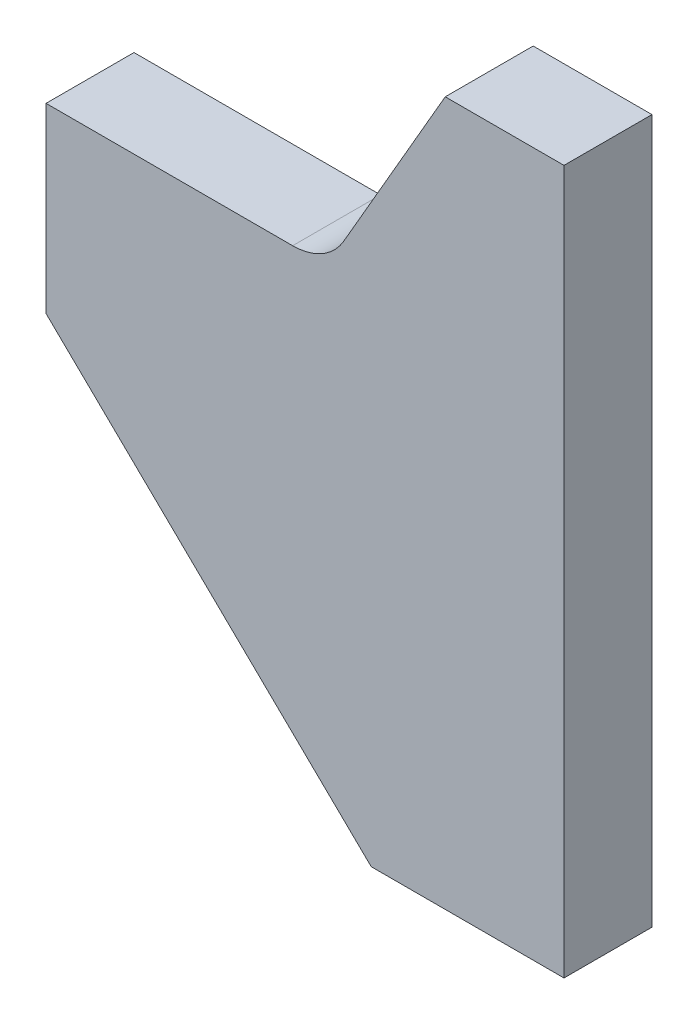
ISO-10303-21;
HEADER;
FILE_DESCRIPTION(('STEP AP214'),'2;1');
FILE_NAME('part.step','',(''),(''),'','','');
FILE_SCHEMA(('AUTOMOTIVE_DESIGN { 1 0 10303 214 1 1 1 1 }'));
ENDSEC;
DATA;
#1=APPLICATION_CONTEXT('core data for automotive mechanical design processes');
#2=APPLICATION_PROTOCOL_DEFINITION('international standard','automotive_design',2000,#1);
#3=PRODUCT_CONTEXT('',#1,'mechanical');
#4=PRODUCT('Part','Part','',(#3));
#5=PRODUCT_RELATED_PRODUCT_CATEGORY('part','',(#4));
#6=PRODUCT_DEFINITION_FORMATION('','',#4);
#7=PRODUCT_DEFINITION_CONTEXT('part definition',#1,'design');
#8=PRODUCT_DEFINITION('design','',#6,#7);
#9=PRODUCT_DEFINITION_SHAPE('','',#8);
#10=(LENGTH_UNIT() NAMED_UNIT(*) SI_UNIT(.MILLI.,.METRE.));
#11=(NAMED_UNIT(*) PLANE_ANGLE_UNIT() SI_UNIT($,.RADIAN.));
#12=(NAMED_UNIT(*) SI_UNIT($,.STERADIAN.) SOLID_ANGLE_UNIT());
#13=UNCERTAINTY_MEASURE_WITH_UNIT(LENGTH_MEASURE(1.E-05),#10,'distance_accuracy_value','');
#14=(GEOMETRIC_REPRESENTATION_CONTEXT(3) GLOBAL_UNCERTAINTY_ASSIGNED_CONTEXT((#13)) GLOBAL_UNIT_ASSIGNED_CONTEXT((#10,
#11,#12)) REPRESENTATION_CONTEXT('',''));
#15=CARTESIAN_POINT('',(0.,0.,0.));
#16=DIRECTION('',(0.,0.,1.));
#17=DIRECTION('',(1.,0.,0.));
#18=AXIS2_PLACEMENT_3D('',#15,#16,#17);
#19=CARTESIAN_POINT('',(79.9250087389884,13.1695836105907,3.));
#20=DIRECTION('',(0.,1.,0.));
#21=DIRECTION('',(0.,0.,1.));
#22=AXIS2_PLACEMENT_3D('',#19,#20,#21);
#23=PLANE('',#22);
#24=DIRECTION('',(1.,0.,0.));
#25=VECTOR('',#24,1.);
#26=CARTESIAN_POINT('',(79.9250087389884,13.1695836105907,0.));
#27=LINE('',#26,#25);
#28=CARTESIAN_POINT('',(79.9250087389884,13.1695836105907,0.));
#29=VERTEX_POINT('',#28);
#30=CARTESIAN_POINT('',(86.5,13.1695836105907,0.));
#31=VERTEX_POINT('',#30);
#32=EDGE_CURVE('E130',#29,#31,#27,.T.);
#33=ORIENTED_EDGE('',*,*,#32,.T.);
#34=DIRECTION('',(0.,0.,-1.));
#35=VECTOR('',#34,1.);
#36=CARTESIAN_POINT('',(86.5,13.1695836105907,3.));
#37=LINE('',#36,#35);
#38=CARTESIAN_POINT('',(86.5,13.1695836105907,3.));
#39=VERTEX_POINT('',#38);
#40=EDGE_CURVE('E11',#39,#31,#37,.T.);
#41=ORIENTED_EDGE('',*,*,#40,.F.);
#42=DIRECTION('',(1.,0.,0.));
#43=VECTOR('',#42,1.);
#44=CARTESIAN_POINT('',(79.9250087389884,13.1695836105907,3.));
#45=LINE('',#44,#43);
#46=CARTESIAN_POINT('',(79.9250087389884,13.1695836105907,3.));
#47=VERTEX_POINT('',#46);
#48=EDGE_CURVE('E146',#47,#39,#45,.T.);
#49=ORIENTED_EDGE('',*,*,#48,.F.);
#50=DIRECTION('',(0.,0.,-1.));
#51=VECTOR('',#50,1.);
#52=CARTESIAN_POINT('',(79.9250087389884,13.1695836105907,3.));
#53=LINE('',#52,#51);
#54=EDGE_CURVE('E49',#47,#29,#53,.T.);
#55=ORIENTED_EDGE('',*,*,#54,.T.);
#56=EDGE_LOOP('',(#33,#41,#49,#55));
#57=FACE_BOUND('',#56,.T.);
#58=ADVANCED_FACE('F33',(#57),#23,.F.);
#59=CARTESIAN_POINT('',(86.5,13.1695836105907,3.));
#60=DIRECTION('',(-1.,0.,0.));
#61=DIRECTION('',(0.,0.,1.));
#62=AXIS2_PLACEMENT_3D('',#59,#60,#61);
#63=PLANE('',#62);
#64=DIRECTION('',(0.,1.,0.));
#65=VECTOR('',#64,1.);
#66=CARTESIAN_POINT('',(86.5,13.1695836105907,0.));
#67=LINE('',#66,#65);
#68=CARTESIAN_POINT('',(86.5,37.1695836105907,0.));
#69=VERTEX_POINT('',#68);
#70=EDGE_CURVE('E132',#31,#69,#67,.T.);
#71=ORIENTED_EDGE('',*,*,#70,.T.);
#72=DIRECTION('',(0.,0.,-1.));
#73=VECTOR('',#72,1.);
#74=CARTESIAN_POINT('',(86.5,37.1695836105907,3.));
#75=LINE('',#74,#73);
#76=CARTESIAN_POINT('',(86.5,37.1695836105907,3.));
#77=VERTEX_POINT('',#76);
#78=EDGE_CURVE('E41',#77,#69,#75,.T.);
#79=ORIENTED_EDGE('',*,*,#78,.F.);
#80=DIRECTION('',(0.,1.,0.));
#81=VECTOR('',#80,1.);
#82=CARTESIAN_POINT('',(86.5,13.1695836105907,3.));
#83=LINE('',#82,#81);
#84=EDGE_CURVE('E88',#39,#77,#83,.T.);
#85=ORIENTED_EDGE('',*,*,#84,.F.);
#86=ORIENTED_EDGE('',*,*,#40,.T.);
#87=EDGE_LOOP('',(#71,#79,#85,#86));
#88=FACE_BOUND('',#87,.T.);
#89=ADVANCED_FACE('F178',(#88),#63,.F.);
#90=CARTESIAN_POINT('',(86.5,37.1695836105907,3.));
#91=DIRECTION('',(0.,-1.,0.));
#92=DIRECTION('',(0.,0.,-1.));
#93=AXIS2_PLACEMENT_3D('',#90,#91,#92);
#94=PLANE('',#93);
#95=DIRECTION('',(-1.,0.,0.));
#96=VECTOR('',#95,1.);
#97=CARTESIAN_POINT('',(86.5,37.1695836105907,0.));
#98=LINE('',#97,#96);
#99=CARTESIAN_POINT('',(82.4499614767683,37.1695836105907,0.));
#100=VERTEX_POINT('',#99);
#101=EDGE_CURVE('E134',#69,#100,#98,.T.);
#102=ORIENTED_EDGE('',*,*,#101,.T.);
#103=DIRECTION('',(0.,0.,-1.));
#104=VECTOR('',#103,1.);
#105=CARTESIAN_POINT('',(82.4499614767683,37.1695836105907,3.));
#106=LINE('',#105,#104);
#107=CARTESIAN_POINT('',(82.4499614767683,37.1695836105907,3.));
#108=VERTEX_POINT('',#107);
#109=EDGE_CURVE('E153',#108,#100,#106,.T.);
#110=ORIENTED_EDGE('',*,*,#109,.F.);
#111=DIRECTION('',(-1.,0.,0.));
#112=VECTOR('',#111,1.);
#113=CARTESIAN_POINT('',(86.5,37.1695836105907,3.));
#114=LINE('',#113,#112);
#115=EDGE_CURVE('E161',#77,#108,#114,.T.);
#116=ORIENTED_EDGE('',*,*,#115,.F.);
#117=ORIENTED_EDGE('',*,*,#78,.T.);
#118=EDGE_LOOP('',(#102,#110,#116,#117));
#119=FACE_BOUND('',#118,.T.);
#120=ADVANCED_FACE('F159',(#119),#94,.F.);
#121=CARTESIAN_POINT('',(82.4499614767683,37.1695836105907,3.));
#122=DIRECTION('',(0.866025403784439,-0.499999999999999,0.));
#123=DIRECTION('',(0.499999999999999,0.866025403784439,0.));
#124=AXIS2_PLACEMENT_3D('',#121,#122,#123);
#125=PLANE('',#124);
#126=DIRECTION('',(-0.499999999999999,-0.86602540378444,0.));
#127=VECTOR('',#126,1.);
#128=CARTESIAN_POINT('',(82.4499614767683,37.1695836105907,0.));
#129=LINE('',#128,#127);
#130=CARTESIAN_POINT('',(78.9897232061625,31.1762751196074,0.));
#131=VERTEX_POINT('',#130);
#132=EDGE_CURVE('E136',#100,#131,#129,.T.);
#133=ORIENTED_EDGE('',*,*,#132,.T.);
#134=DIRECTION('',(0.,0.,-1.));
#135=VECTOR('',#134,1.);
#136=CARTESIAN_POINT('',(78.9897232061625,31.1762751196074,3.));
#137=LINE('',#136,#135);
#138=CARTESIAN_POINT('',(78.9897232061625,31.1762751196074,3.));
#139=VERTEX_POINT('',#138);
#140=EDGE_CURVE('E150',#139,#131,#137,.T.);
#141=ORIENTED_EDGE('',*,*,#140,.F.);
#142=DIRECTION('',(-0.499999999999999,-0.86602540378444,0.));
#143=VECTOR('',#142,1.);
#144=CARTESIAN_POINT('',(82.4499614767683,37.1695836105907,3.));
#145=LINE('',#144,#143);
#146=EDGE_CURVE('E172',#108,#139,#145,.T.);
#147=ORIENTED_EDGE('',*,*,#146,.F.);
#148=ORIENTED_EDGE('',*,*,#109,.T.);
#149=EDGE_LOOP('',(#133,#141,#147,#148));
#150=FACE_BOUND('',#149,.T.);
#151=ADVANCED_FACE('F168',(#150),#125,.F.);
#152=CARTESIAN_POINT('',(77.2460823649977,32.1829666286239,3.));
#153=DIRECTION('',(0.,0.,-1.));
#154=DIRECTION('',(-1.,0.,0.));
#155=AXIS2_PLACEMENT_3D('',#152,#153,#154);
#156=CYLINDRICAL_SURFACE('',#155,2.01338301803311);
#157=CARTESIAN_POINT('',(77.2460823649977,32.1829666286239,0.));
#158=DIRECTION('',(0.,0.,-1.));
#159=DIRECTION('',(-1.,0.,0.));
#160=AXIS2_PLACEMENT_3D('',#157,#158,#159);
#161=CIRCLE('',#160,2.01338301803311);
#162=CARTESIAN_POINT('',(77.2460823649977,30.1695836105908,0.));
#163=VERTEX_POINT('',#162);
#164=EDGE_CURVE('E138',#131,#163,#161,.T.);
#165=ORIENTED_EDGE('',*,*,#164,.T.);
#166=DIRECTION('',(0.,0.,-1.));
#167=VECTOR('',#166,1.);
#168=CARTESIAN_POINT('',(77.2460823649977,30.1695836105908,3.));
#169=LINE('',#168,#167);
#170=CARTESIAN_POINT('',(77.2460823649977,30.1695836105908,3.));
#171=VERTEX_POINT('',#170);
#172=EDGE_CURVE('E122',#171,#163,#169,.T.);
#173=ORIENTED_EDGE('',*,*,#172,.F.);
#174=CARTESIAN_POINT('',(77.2460823649977,32.1829666286239,3.));
#175=DIRECTION('',(0.,0.,-1.));
#176=DIRECTION('',(-1.,0.,0.));
#177=AXIS2_PLACEMENT_3D('',#174,#175,#176);
#178=CIRCLE('',#177,2.01338301803311);
#179=EDGE_CURVE('E110',#139,#171,#178,.T.);
#180=ORIENTED_EDGE('',*,*,#179,.F.);
#181=ORIENTED_EDGE('',*,*,#140,.T.);
#182=EDGE_LOOP('',(#165,#173,#180,#181));
#183=FACE_BOUND('',#182,.T.);
#184=ADVANCED_FACE('F171',(#183),#156,.F.);
#185=CARTESIAN_POINT('',(77.2460823649977,30.1695836105908,3.));
#186=DIRECTION('',(0.,-1.,0.));
#187=DIRECTION('',(0.,0.,-1.));
#188=AXIS2_PLACEMENT_3D('',#185,#186,#187);
#189=PLANE('',#188);
#190=DIRECTION('',(-1.,0.,0.));
#191=VECTOR('',#190,1.);
#192=CARTESIAN_POINT('',(77.2460823649977,30.1695836105908,0.));
#193=LINE('',#192,#191);
#194=CARTESIAN_POINT('',(68.8361695700337,30.1695836105908,0.));
#195=VERTEX_POINT('',#194);
#196=EDGE_CURVE('E119',#163,#195,#193,.T.);
#197=ORIENTED_EDGE('',*,*,#196,.T.);
#198=DIRECTION('',(0.,0.,-1.));
#199=VECTOR('',#198,1.);
#200=CARTESIAN_POINT('',(68.8361695700337,30.1695836105908,3.));
#201=LINE('',#200,#199);
#202=CARTESIAN_POINT('',(68.8361695700337,30.1695836105908,3.));
#203=VERTEX_POINT('',#202);
#204=EDGE_CURVE('E116',#203,#195,#201,.T.);
#205=ORIENTED_EDGE('',*,*,#204,.F.);
#206=DIRECTION('',(-1.,0.,0.));
#207=VECTOR('',#206,1.);
#208=CARTESIAN_POINT('',(77.2460823649977,30.1695836105908,3.));
#209=LINE('',#208,#207);
#210=EDGE_CURVE('E103',#171,#203,#209,.T.);
#211=ORIENTED_EDGE('',*,*,#210,.F.);
#212=ORIENTED_EDGE('',*,*,#172,.T.);
#213=EDGE_LOOP('',(#197,#205,#211,#212));
#214=FACE_BOUND('',#213,.T.);
#215=ADVANCED_FACE('F117',(#214),#189,.F.);
#216=CARTESIAN_POINT('',(68.8361695700337,30.1695836105908,3.));
#217=DIRECTION('',(1.,0.,0.));
#218=DIRECTION('',(0.,0.,-1.));
#219=AXIS2_PLACEMENT_3D('',#216,#217,#218);
#220=PLANE('',#219);
#221=DIRECTION('',(0.,-1.,0.));
#222=VECTOR('',#221,1.);
#223=CARTESIAN_POINT('',(68.8361695700337,30.1695836105908,0.));
#224=LINE('',#223,#222);
#225=CARTESIAN_POINT('',(68.8361695700337,23.9620237925293,0.));
#226=VERTEX_POINT('',#225);
#227=EDGE_CURVE('E141',#195,#226,#224,.T.);
#228=ORIENTED_EDGE('',*,*,#227,.T.);
#229=DIRECTION('',(0.,0.,-1.));
#230=VECTOR('',#229,1.);
#231=CARTESIAN_POINT('',(68.8361695700337,23.9620237925293,3.));
#232=LINE('',#231,#230);
#233=CARTESIAN_POINT('',(68.8361695700337,23.9620237925293,3.));
#234=VERTEX_POINT('',#233);
#235=EDGE_CURVE('E76',#234,#226,#232,.T.);
#236=ORIENTED_EDGE('',*,*,#235,.F.);
#237=DIRECTION('',(0.,-1.,0.));
#238=VECTOR('',#237,1.);
#239=CARTESIAN_POINT('',(68.8361695700337,30.1695836105908,3.));
#240=LINE('',#239,#238);
#241=EDGE_CURVE('E108',#203,#234,#240,.T.);
#242=ORIENTED_EDGE('',*,*,#241,.F.);
#243=ORIENTED_EDGE('',*,*,#204,.T.);
#244=EDGE_LOOP('',(#228,#236,#242,#243));
#245=FACE_BOUND('',#244,.T.);
#246=ADVANCED_FACE('F124',(#245),#220,.F.);
#247=CARTESIAN_POINT('',(79.9250087389884,13.1695836105907,3.));
#248=DIRECTION('',(-0.697464483292131,-0.71661935122214,0.));
#249=DIRECTION('',(0.71661935122214,-0.697464483292131,0.));
#250=AXIS2_PLACEMENT_3D('',#247,#248,#249);
#251=PLANE('',#250);
#252=DIRECTION('',(-0.71661935122214,0.697464483292131,0.));
#253=VECTOR('',#252,1.);
#254=CARTESIAN_POINT('',(79.9250087389884,13.1695836105907,0.));
#255=LINE('',#254,#253);
#256=EDGE_CURVE('E143',#29,#226,#255,.T.);
#257=ORIENTED_EDGE('',*,*,#256,.F.);
#258=ORIENTED_EDGE('',*,*,#54,.F.);
#259=DIRECTION('',(-0.71661935122214,0.697464483292131,0.));
#260=VECTOR('',#259,1.);
#261=CARTESIAN_POINT('',(79.9250087389884,13.1695836105907,3.));
#262=LINE('',#261,#260);
#263=EDGE_CURVE('E125',#47,#234,#262,.T.);
#264=ORIENTED_EDGE('',*,*,#263,.T.);
#265=ORIENTED_EDGE('',*,*,#235,.T.);
#266=EDGE_LOOP('',(#257,#258,#264,#265));
#267=FACE_BOUND('',#266,.T.);
#268=ADVANCED_FACE('F194',(#267),#251,.T.);
#269=CARTESIAN_POINT('',(77.2460823649977,32.1829666286239,3.));
#270=DIRECTION('',(0.,0.,-1.));
#271=DIRECTION('',(-1.,0.,0.));
#272=AXIS2_PLACEMENT_3D('',#269,#270,#271);
#273=PLANE('',#272);
#274=ORIENTED_EDGE('',*,*,#48,.T.);
#275=ORIENTED_EDGE('',*,*,#84,.T.);
#276=ORIENTED_EDGE('',*,*,#115,.T.);
#277=ORIENTED_EDGE('',*,*,#146,.T.);
#278=ORIENTED_EDGE('',*,*,#179,.T.);
#279=ORIENTED_EDGE('',*,*,#210,.T.);
#280=ORIENTED_EDGE('',*,*,#241,.T.);
#281=ORIENTED_EDGE('',*,*,#263,.F.);
#282=EDGE_LOOP('',(#274,#275,#276,#277,#278,#279,#280,#281));
#283=FACE_BOUND('',#282,.T.);
#284=ADVANCED_FACE('F105',(#283),#273,.F.);
#285=CARTESIAN_POINT('',(77.2460823649977,32.1829666286239,0.));
#286=DIRECTION('',(0.,0.,-1.));
#287=DIRECTION('',(-1.,0.,0.));
#288=AXIS2_PLACEMENT_3D('',#285,#286,#287);
#289=PLANE('',#288);
#290=ORIENTED_EDGE('',*,*,#32,.F.);
#291=ORIENTED_EDGE('',*,*,#256,.T.);
#292=ORIENTED_EDGE('',*,*,#227,.F.);
#293=ORIENTED_EDGE('',*,*,#196,.F.);
#294=ORIENTED_EDGE('',*,*,#164,.F.);
#295=ORIENTED_EDGE('',*,*,#132,.F.);
#296=ORIENTED_EDGE('',*,*,#101,.F.);
#297=ORIENTED_EDGE('',*,*,#70,.F.);
#298=EDGE_LOOP('',(#290,#291,#292,#293,#294,#295,#296,#297));
#299=FACE_BOUND('',#298,.T.);
#300=ADVANCED_FACE('F164',(#299),#289,.T.);
#301=CLOSED_SHELL('',(#58,#89,#120,#151,#184,#215,#246,#268,#284,#300));
#302=MANIFOLD_SOLID_BREP('B2',#301);
#303=ADVANCED_BREP_SHAPE_REPRESENTATION('',(#18,#302),#14);
#304=SHAPE_DEFINITION_REPRESENTATION(#9,#303);
ENDSEC;
END-ISO-10303-21;
